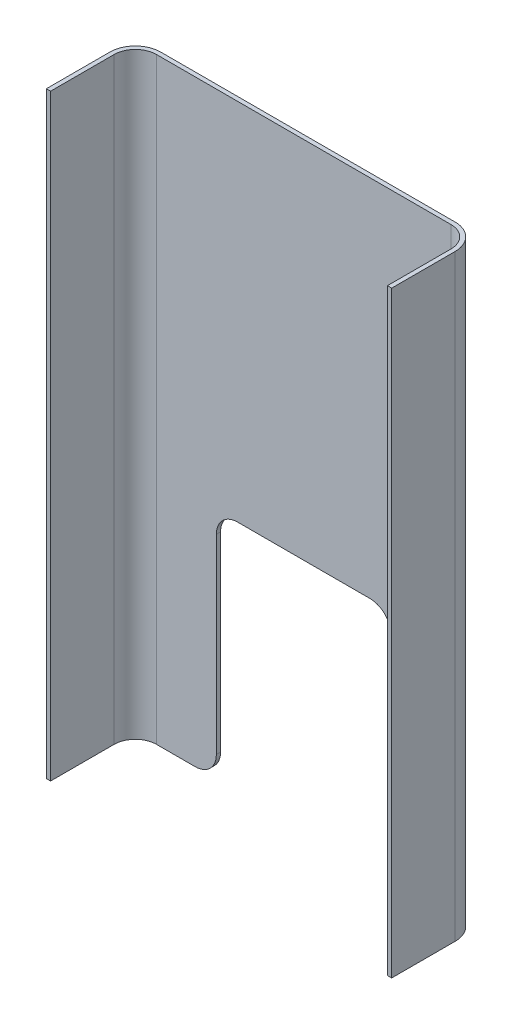
ISO-10303-21;
HEADER;
FILE_DESCRIPTION(('STEP AP214'),'2;1');
FILE_NAME('part.step','',(''),(''),'','','');
FILE_SCHEMA(('AUTOMOTIVE_DESIGN { 1 0 10303 214 1 1 1 1 }'));
ENDSEC;
DATA;
#1=APPLICATION_CONTEXT('core data for automotive mechanical design processes');
#2=APPLICATION_PROTOCOL_DEFINITION('international standard','automotive_design',2000,#1);
#3=PRODUCT_CONTEXT('',#1,'mechanical');
#4=PRODUCT('Part','Part','',(#3));
#5=PRODUCT_RELATED_PRODUCT_CATEGORY('part','',(#4));
#6=PRODUCT_DEFINITION_FORMATION('','',#4);
#7=PRODUCT_DEFINITION_CONTEXT('part definition',#1,'design');
#8=PRODUCT_DEFINITION('design','',#6,#7);
#9=PRODUCT_DEFINITION_SHAPE('','',#8);
#10=(LENGTH_UNIT() NAMED_UNIT(*) SI_UNIT(.MILLI.,.METRE.));
#11=(NAMED_UNIT(*) PLANE_ANGLE_UNIT() SI_UNIT($,.RADIAN.));
#12=(NAMED_UNIT(*) SI_UNIT($,.STERADIAN.) SOLID_ANGLE_UNIT());
#13=UNCERTAINTY_MEASURE_WITH_UNIT(LENGTH_MEASURE(1.E-05),#10,'distance_accuracy_value','');
#14=(GEOMETRIC_REPRESENTATION_CONTEXT(3) GLOBAL_UNCERTAINTY_ASSIGNED_CONTEXT((#13)) GLOBAL_UNIT_ASSIGNED_CONTEXT((#10,
#11,#12)) REPRESENTATION_CONTEXT('',''));
#15=CARTESIAN_POINT('',(0.,0.,0.));
#16=DIRECTION('',(0.,0.,1.));
#17=DIRECTION('',(1.,0.,0.));
#18=AXIS2_PLACEMENT_3D('',#15,#16,#17);
#19=CARTESIAN_POINT('',(139.,0.,20.));
#20=DIRECTION('',(0.,1.,0.));
#21=DIRECTION('',(1.,0.,0.));
#22=AXIS2_PLACEMENT_3D('',#19,#20,#21);
#23=PLANE('',#22);
#24=DIRECTION('',(1.,0.,0.));
#25=VECTOR('',#24,1.);
#26=CARTESIAN_POINT('',(-139.,0.,0.));
#27=LINE('',#26,#25);
#28=CARTESIAN_POINT('',(102.5,0.,0.));
#29=VERTEX_POINT('',#28);
#30=CARTESIAN_POINT('',(139.,0.,0.));
#31=VERTEX_POINT('',#30);
#32=EDGE_CURVE('E260',#29,#31,#27,.T.);
#33=ORIENTED_EDGE('',*,*,#32,.F.);
#34=DIRECTION('',(0.,0.,-1.));
#35=VECTOR('',#34,1.);
#36=CARTESIAN_POINT('',(102.5,0.,20.));
#37=LINE('',#36,#35);
#38=CARTESIAN_POINT('',(102.5,0.,-4.));
#39=VERTEX_POINT('',#38);
#40=EDGE_CURVE('E305',#29,#39,#37,.T.);
#41=ORIENTED_EDGE('',*,*,#40,.T.);
#42=DIRECTION('',(1.,0.,0.));
#43=VECTOR('',#42,1.);
#44=CARTESIAN_POINT('',(-139.,0.,-4.));
#45=LINE('',#44,#43);
#46=CARTESIAN_POINT('',(139.,0.,-3.99999999999999));
#47=VERTEX_POINT('',#46);
#48=EDGE_CURVE('E243',#39,#47,#45,.T.);
#49=ORIENTED_EDGE('',*,*,#48,.T.);
#50=CARTESIAN_POINT('',(139.,0.,20.));
#51=DIRECTION('',(0.,1.,0.));
#52=DIRECTION('',(1.,0.,0.));
#53=AXIS2_PLACEMENT_3D('',#50,#51,#52);
#54=CIRCLE('',#53,24.);
#55=CARTESIAN_POINT('',(163.,0.,20.));
#56=VERTEX_POINT('',#55);
#57=EDGE_CURVE('E240',#47,#56,#54,.F.);
#58=ORIENTED_EDGE('',*,*,#57,.T.);
#59=DIRECTION('',(0.,0.,-1.));
#60=VECTOR('',#59,1.);
#61=CARTESIAN_POINT('',(163.,0.,20.));
#62=LINE('',#61,#60);
#63=CARTESIAN_POINT('',(163.,0.,80.));
#64=VERTEX_POINT('',#63);
#65=EDGE_CURVE('E237',#56,#64,#62,.F.);
#66=ORIENTED_EDGE('',*,*,#65,.T.);
#67=DIRECTION('',(-1.,0.,0.));
#68=VECTOR('',#67,1.);
#69=CARTESIAN_POINT('',(163.,0.,80.));
#70=LINE('',#69,#68);
#71=CARTESIAN_POINT('',(159.,0.,80.));
#72=VERTEX_POINT('',#71);
#73=EDGE_CURVE('E234',#64,#72,#70,.T.);
#74=ORIENTED_EDGE('',*,*,#73,.T.);
#75=DIRECTION('',(0.,0.,1.));
#76=VECTOR('',#75,1.);
#77=CARTESIAN_POINT('',(159.,0.,20.));
#78=LINE('',#77,#76);
#79=CARTESIAN_POINT('',(159.,0.,20.));
#80=VERTEX_POINT('',#79);
#81=EDGE_CURVE('E197',#80,#72,#78,.T.);
#82=ORIENTED_EDGE('',*,*,#81,.F.);
#83=CARTESIAN_POINT('',(139.,0.,20.));
#84=DIRECTION('',(0.,-1.,0.));
#85=DIRECTION('',(0.,0.,-1.));
#86=AXIS2_PLACEMENT_3D('',#83,#84,#85);
#87=CIRCLE('',#86,20.);
#88=EDGE_CURVE('E191',#31,#80,#87,.T.);
#89=ORIENTED_EDGE('',*,*,#88,.F.);
#90=EDGE_LOOP('',(#33,#41,#49,#58,#66,#74,#82,#89));
#91=FACE_BOUND('',#90,.T.);
#92=ADVANCED_FACE('F41',(#91),#23,.F.);
#93=CARTESIAN_POINT('',(159.,564.,20.));
#94=DIRECTION('',(1.,0.,0.));
#95=DIRECTION('',(0.,0.,-1.));
#96=AXIS2_PLACEMENT_3D('',#93,#94,#95);
#97=PLANE('',#96);
#98=ORIENTED_EDGE('',*,*,#81,.T.);
#99=DIRECTION('',(0.,-1.,0.));
#100=VECTOR('',#99,1.);
#101=CARTESIAN_POINT('',(159.,564.,80.));
#102=LINE('',#101,#100);
#103=CARTESIAN_POINT('',(159.,564.,80.));
#104=VERTEX_POINT('',#103);
#105=EDGE_CURVE('E194',#104,#72,#102,.T.);
#106=ORIENTED_EDGE('',*,*,#105,.F.);
#107=DIRECTION('',(0.,0.,1.));
#108=VECTOR('',#107,1.);
#109=CARTESIAN_POINT('',(159.,564.,20.));
#110=LINE('',#109,#108);
#111=CARTESIAN_POINT('',(159.,564.,20.));
#112=VERTEX_POINT('',#111);
#113=EDGE_CURVE('E179',#112,#104,#110,.T.);
#114=ORIENTED_EDGE('',*,*,#113,.F.);
#115=DIRECTION('',(0.,-1.,0.));
#116=VECTOR('',#115,1.);
#117=CARTESIAN_POINT('',(159.,564.,20.));
#118=LINE('',#117,#116);
#119=EDGE_CURVE('E232',#112,#80,#118,.T.);
#120=ORIENTED_EDGE('',*,*,#119,.T.);
#121=EDGE_LOOP('',(#98,#106,#114,#120));
#122=FACE_BOUND('',#121,.T.);
#123=ADVANCED_FACE('F195',(#122),#97,.F.);
#124=CARTESIAN_POINT('',(163.,564.,80.));
#125=DIRECTION('',(0.,0.,1.));
#126=DIRECTION('',(1.,0.,0.));
#127=AXIS2_PLACEMENT_3D('',#124,#125,#126);
#128=PLANE('',#127);
#129=ORIENTED_EDGE('',*,*,#73,.F.);
#130=DIRECTION('',(0.,-1.,0.));
#131=VECTOR('',#130,1.);
#132=CARTESIAN_POINT('',(163.,564.,80.));
#133=LINE('',#132,#131);
#134=CARTESIAN_POINT('',(163.,564.,80.));
#135=VERTEX_POINT('',#134);
#136=EDGE_CURVE('E202',#135,#64,#133,.T.);
#137=ORIENTED_EDGE('',*,*,#136,.F.);
#138=DIRECTION('',(-1.,0.,0.));
#139=VECTOR('',#138,1.);
#140=CARTESIAN_POINT('',(163.,564.,80.));
#141=LINE('',#140,#139);
#142=EDGE_CURVE('E184',#135,#104,#141,.T.);
#143=ORIENTED_EDGE('',*,*,#142,.T.);
#144=ORIENTED_EDGE('',*,*,#105,.T.);
#145=EDGE_LOOP('',(#129,#137,#143,#144));
#146=FACE_BOUND('',#145,.T.);
#147=ADVANCED_FACE('F204',(#146),#128,.T.);
#148=CARTESIAN_POINT('',(163.,564.,20.));
#149=DIRECTION('',(1.,0.,0.));
#150=DIRECTION('',(0.,0.,-1.));
#151=AXIS2_PLACEMENT_3D('',#148,#149,#150);
#152=PLANE('',#151);
#153=ORIENTED_EDGE('',*,*,#65,.F.);
#154=DIRECTION('',(0.,-1.,0.));
#155=VECTOR('',#154,1.);
#156=CARTESIAN_POINT('',(163.,564.,20.));
#157=LINE('',#156,#155);
#158=CARTESIAN_POINT('',(163.,564.,20.));
#159=VERTEX_POINT('',#158);
#160=EDGE_CURVE('E286',#159,#56,#157,.T.);
#161=ORIENTED_EDGE('',*,*,#160,.F.);
#162=DIRECTION('',(0.,0.,-1.));
#163=VECTOR('',#162,1.);
#164=CARTESIAN_POINT('',(163.,564.,20.));
#165=LINE('',#164,#163);
#166=EDGE_CURVE('E205',#159,#135,#165,.F.);
#167=ORIENTED_EDGE('',*,*,#166,.T.);
#168=ORIENTED_EDGE('',*,*,#136,.T.);
#169=EDGE_LOOP('',(#153,#161,#167,#168));
#170=FACE_BOUND('',#169,.T.);
#171=ADVANCED_FACE('F395',(#170),#152,.T.);
#172=CARTESIAN_POINT('',(139.,564.,20.));
#173=DIRECTION('',(0.,-1.,0.));
#174=DIRECTION('',(0.,0.,-1.));
#175=AXIS2_PLACEMENT_3D('',#172,#173,#174);
#176=CYLINDRICAL_SURFACE('',#175,24.);
#177=ORIENTED_EDGE('',*,*,#57,.F.);
#178=DIRECTION('',(0.,-1.,0.));
#179=VECTOR('',#178,1.);
#180=CARTESIAN_POINT('',(139.,564.,-3.99999999999999));
#181=LINE('',#180,#179);
#182=CARTESIAN_POINT('',(139.,564.,-3.99999999999999));
#183=VERTEX_POINT('',#182);
#184=EDGE_CURVE('E283',#183,#47,#181,.T.);
#185=ORIENTED_EDGE('',*,*,#184,.F.);
#186=CARTESIAN_POINT('',(139.,564.,20.));
#187=DIRECTION('',(0.,1.,0.));
#188=DIRECTION('',(1.,0.,0.));
#189=AXIS2_PLACEMENT_3D('',#186,#187,#188);
#190=CIRCLE('',#189,24.);
#191=EDGE_CURVE('E207',#183,#159,#190,.F.);
#192=ORIENTED_EDGE('',*,*,#191,.T.);
#193=ORIENTED_EDGE('',*,*,#160,.T.);
#194=EDGE_LOOP('',(#177,#185,#192,#193));
#195=FACE_BOUND('',#194,.T.);
#196=ADVANCED_FACE('F392',(#195),#176,.T.);
#197=CARTESIAN_POINT('',(-139.,564.,-4.));
#198=DIRECTION('',(0.,0.,-1.));
#199=DIRECTION('',(-1.,0.,0.));
#200=AXIS2_PLACEMENT_3D('',#197,#198,#199);
#201=PLANE('',#200);
#202=DIRECTION('',(0.,1.,0.));
#203=VECTOR('',#202,1.);
#204=CARTESIAN_POINT('',(-82.5,564.,-4.));
#205=LINE('',#204,#203);
#206=CARTESIAN_POINT('',(-82.5,20.,-4.));
#207=VERTEX_POINT('',#206);
#208=CARTESIAN_POINT('',(-82.5,200.,-4.));
#209=VERTEX_POINT('',#208);
#210=EDGE_CURVE('E322',#207,#209,#205,.T.);
#211=ORIENTED_EDGE('',*,*,#210,.F.);
#212=CARTESIAN_POINT('',(-102.5,20.,-4.));
#213=DIRECTION('',(0.,0.,-1.));
#214=DIRECTION('',(-1.,0.,0.));
#215=AXIS2_PLACEMENT_3D('',#212,#213,#214);
#216=CIRCLE('',#215,20.);
#217=CARTESIAN_POINT('',(-102.5,0.,-4.));
#218=VERTEX_POINT('',#217);
#219=EDGE_CURVE('E303',#207,#218,#216,.T.);
#220=ORIENTED_EDGE('',*,*,#219,.T.);
#221=CARTESIAN_POINT('',(-139.,0.,-4.));
#222=VERTEX_POINT('',#221);
#223=EDGE_CURVE('E244',#222,#218,#45,.T.);
#224=ORIENTED_EDGE('',*,*,#223,.F.);
#225=DIRECTION('',(0.,-1.,0.));
#226=VECTOR('',#225,1.);
#227=CARTESIAN_POINT('',(-139.,564.,-4.));
#228=LINE('',#227,#226);
#229=CARTESIAN_POINT('',(-139.,564.,-4.));
#230=VERTEX_POINT('',#229);
#231=EDGE_CURVE('E281',#230,#222,#228,.T.);
#232=ORIENTED_EDGE('',*,*,#231,.F.);
#233=DIRECTION('',(1.,0.,0.));
#234=VECTOR('',#233,1.);
#235=CARTESIAN_POINT('',(-139.,564.,-4.));
#236=LINE('',#235,#234);
#237=EDGE_CURVE('E213',#230,#183,#236,.T.);
#238=ORIENTED_EDGE('',*,*,#237,.T.);
#239=ORIENTED_EDGE('',*,*,#184,.T.);
#240=ORIENTED_EDGE('',*,*,#48,.F.);
#241=CARTESIAN_POINT('',(102.5,20.,-4.));
#242=DIRECTION('',(0.,0.,-1.));
#243=DIRECTION('',(-1.,0.,0.));
#244=AXIS2_PLACEMENT_3D('',#241,#242,#243);
#245=CIRCLE('',#244,20.);
#246=CARTESIAN_POINT('',(82.5,20.,-4.));
#247=VERTEX_POINT('',#246);
#248=EDGE_CURVE('E56',#39,#247,#245,.T.);
#249=ORIENTED_EDGE('',*,*,#248,.T.);
#250=DIRECTION('',(0.,-1.,0.));
#251=VECTOR('',#250,1.);
#252=CARTESIAN_POINT('',(82.5,564.,-4.));
#253=LINE('',#252,#251);
#254=CARTESIAN_POINT('',(82.5,200.,-4.));
#255=VERTEX_POINT('',#254);
#256=EDGE_CURVE('E352',#255,#247,#253,.T.);
#257=ORIENTED_EDGE('',*,*,#256,.F.);
#258=CARTESIAN_POINT('',(62.5,200.,-4.));
#259=DIRECTION('',(0.,0.,-1.));
#260=DIRECTION('',(-1.,0.,0.));
#261=AXIS2_PLACEMENT_3D('',#258,#259,#260);
#262=CIRCLE('',#261,20.);
#263=CARTESIAN_POINT('',(62.5,220.,-4.));
#264=VERTEX_POINT('',#263);
#265=EDGE_CURVE('E64',#255,#264,#262,.F.);
#266=ORIENTED_EDGE('',*,*,#265,.T.);
#267=DIRECTION('',(1.,0.,0.));
#268=VECTOR('',#267,1.);
#269=CARTESIAN_POINT('',(-139.,220.,-4.));
#270=LINE('',#269,#268);
#271=CARTESIAN_POINT('',(-62.5,220.,-4.));
#272=VERTEX_POINT('',#271);
#273=EDGE_CURVE('E235',#272,#264,#270,.T.);
#274=ORIENTED_EDGE('',*,*,#273,.F.);
#275=CARTESIAN_POINT('',(-62.5,200.,-4.));
#276=DIRECTION('',(0.,0.,-1.));
#277=DIRECTION('',(-1.,0.,0.));
#278=AXIS2_PLACEMENT_3D('',#275,#276,#277);
#279=CIRCLE('',#278,20.);
#280=EDGE_CURVE('E49',#272,#209,#279,.F.);
#281=ORIENTED_EDGE('',*,*,#280,.T.);
#282=EDGE_LOOP('',(#211,#220,#224,#232,#238,#239,#240,#249,#257,#266,#274,#281));
#283=FACE_BOUND('',#282,.T.);
#284=ADVANCED_FACE('F321',(#283),#201,.T.);
#285=CARTESIAN_POINT('',(-139.,564.,20.));
#286=DIRECTION('',(0.,-1.,0.));
#287=DIRECTION('',(0.,0.,-1.));
#288=AXIS2_PLACEMENT_3D('',#285,#286,#287);
#289=CYLINDRICAL_SURFACE('',#288,24.);
#290=CARTESIAN_POINT('',(-139.,0.,20.));
#291=DIRECTION('',(0.,1.,0.));
#292=DIRECTION('',(1.,0.,0.));
#293=AXIS2_PLACEMENT_3D('',#290,#291,#292);
#294=CIRCLE('',#293,24.);
#295=CARTESIAN_POINT('',(-163.,0.,20.));
#296=VERTEX_POINT('',#295);
#297=EDGE_CURVE('E247',#296,#222,#294,.F.);
#298=ORIENTED_EDGE('',*,*,#297,.F.);
#299=DIRECTION('',(0.,-1.,0.));
#300=VECTOR('',#299,1.);
#301=CARTESIAN_POINT('',(-163.,564.,20.));
#302=LINE('',#301,#300);
#303=CARTESIAN_POINT('',(-163.,564.,20.));
#304=VERTEX_POINT('',#303);
#305=EDGE_CURVE('E279',#304,#296,#302,.T.);
#306=ORIENTED_EDGE('',*,*,#305,.F.);
#307=CARTESIAN_POINT('',(-139.,564.,20.));
#308=DIRECTION('',(0.,1.,0.));
#309=DIRECTION('',(1.,0.,0.));
#310=AXIS2_PLACEMENT_3D('',#307,#308,#309);
#311=CIRCLE('',#310,24.);
#312=EDGE_CURVE('E216',#304,#230,#311,.F.);
#313=ORIENTED_EDGE('',*,*,#312,.T.);
#314=ORIENTED_EDGE('',*,*,#231,.T.);
#315=EDGE_LOOP('',(#298,#306,#313,#314));
#316=FACE_BOUND('',#315,.T.);
#317=ADVANCED_FACE('F385',(#316),#289,.T.);
#318=CARTESIAN_POINT('',(-163.,564.,80.));
#319=DIRECTION('',(-1.,0.,0.));
#320=DIRECTION('',(0.,0.,1.));
#321=AXIS2_PLACEMENT_3D('',#318,#319,#320);
#322=PLANE('',#321);
#323=DIRECTION('',(0.,0.,-1.));
#324=VECTOR('',#323,1.);
#325=CARTESIAN_POINT('',(-163.,0.,80.));
#326=LINE('',#325,#324);
#327=CARTESIAN_POINT('',(-163.,0.,80.));
#328=VERTEX_POINT('',#327);
#329=EDGE_CURVE('E250',#328,#296,#326,.T.);
#330=ORIENTED_EDGE('',*,*,#329,.F.);
#331=DIRECTION('',(0.,-1.,0.));
#332=VECTOR('',#331,1.);
#333=CARTESIAN_POINT('',(-163.,564.,80.));
#334=LINE('',#333,#332);
#335=CARTESIAN_POINT('',(-163.,564.,80.));
#336=VERTEX_POINT('',#335);
#337=EDGE_CURVE('E277',#336,#328,#334,.T.);
#338=ORIENTED_EDGE('',*,*,#337,.F.);
#339=DIRECTION('',(0.,0.,-1.));
#340=VECTOR('',#339,1.);
#341=CARTESIAN_POINT('',(-163.,564.,80.));
#342=LINE('',#341,#340);
#343=EDGE_CURVE('E219',#336,#304,#342,.T.);
#344=ORIENTED_EDGE('',*,*,#343,.T.);
#345=ORIENTED_EDGE('',*,*,#305,.T.);
#346=EDGE_LOOP('',(#330,#338,#344,#345));
#347=FACE_BOUND('',#346,.T.);
#348=ADVANCED_FACE('F525',(#347),#322,.T.);
#349=CARTESIAN_POINT('',(-159.,564.,80.));
#350=DIRECTION('',(0.,0.,1.));
#351=DIRECTION('',(1.,0.,0.));
#352=AXIS2_PLACEMENT_3D('',#349,#350,#351);
#353=PLANE('',#352);
#354=DIRECTION('',(-1.,0.,0.));
#355=VECTOR('',#354,1.);
#356=CARTESIAN_POINT('',(-159.,0.,80.));
#357=LINE('',#356,#355);
#358=CARTESIAN_POINT('',(-159.,0.,80.));
#359=VERTEX_POINT('',#358);
#360=EDGE_CURVE('E253',#359,#328,#357,.T.);
#361=ORIENTED_EDGE('',*,*,#360,.F.);
#362=DIRECTION('',(0.,-1.,0.));
#363=VECTOR('',#362,1.);
#364=CARTESIAN_POINT('',(-159.,564.,80.));
#365=LINE('',#364,#363);
#366=CARTESIAN_POINT('',(-159.,564.,80.));
#367=VERTEX_POINT('',#366);
#368=EDGE_CURVE('E275',#367,#359,#365,.T.);
#369=ORIENTED_EDGE('',*,*,#368,.F.);
#370=DIRECTION('',(-1.,0.,0.));
#371=VECTOR('',#370,1.);
#372=CARTESIAN_POINT('',(-159.,564.,80.));
#373=LINE('',#372,#371);
#374=EDGE_CURVE('E222',#367,#336,#373,.T.);
#375=ORIENTED_EDGE('',*,*,#374,.T.);
#376=ORIENTED_EDGE('',*,*,#337,.T.);
#377=EDGE_LOOP('',(#361,#369,#375,#376));
#378=FACE_BOUND('',#377,.T.);
#379=ADVANCED_FACE('F515',(#378),#353,.T.);
#380=CARTESIAN_POINT('',(-159.,564.,80.));
#381=DIRECTION('',(-1.,0.,0.));
#382=DIRECTION('',(0.,0.,1.));
#383=AXIS2_PLACEMENT_3D('',#380,#381,#382);
#384=PLANE('',#383);
#385=DIRECTION('',(0.,0.,-1.));
#386=VECTOR('',#385,1.);
#387=CARTESIAN_POINT('',(-159.,0.,80.));
#388=LINE('',#387,#386);
#389=CARTESIAN_POINT('',(-159.,0.,20.));
#390=VERTEX_POINT('',#389);
#391=EDGE_CURVE('E256',#359,#390,#388,.T.);
#392=ORIENTED_EDGE('',*,*,#391,.T.);
#393=DIRECTION('',(0.,-1.,0.));
#394=VECTOR('',#393,1.);
#395=CARTESIAN_POINT('',(-159.,564.,20.));
#396=LINE('',#395,#394);
#397=CARTESIAN_POINT('',(-159.,564.,20.));
#398=VERTEX_POINT('',#397);
#399=EDGE_CURVE('E272',#398,#390,#396,.T.);
#400=ORIENTED_EDGE('',*,*,#399,.F.);
#401=DIRECTION('',(0.,0.,-1.));
#402=VECTOR('',#401,1.);
#403=CARTESIAN_POINT('',(-159.,564.,80.));
#404=LINE('',#403,#402);
#405=EDGE_CURVE('E225',#367,#398,#404,.T.);
#406=ORIENTED_EDGE('',*,*,#405,.F.);
#407=ORIENTED_EDGE('',*,*,#368,.T.);
#408=EDGE_LOOP('',(#392,#400,#406,#407));
#409=FACE_BOUND('',#408,.T.);
#410=ADVANCED_FACE('F506',(#409),#384,.F.);
#411=CARTESIAN_POINT('',(-139.,564.,20.));
#412=DIRECTION('',(0.,-1.,0.));
#413=DIRECTION('',(0.,0.,-1.));
#414=AXIS2_PLACEMENT_3D('',#411,#412,#413);
#415=CYLINDRICAL_SURFACE('',#414,20.);
#416=CARTESIAN_POINT('',(-139.,0.,20.));
#417=DIRECTION('',(0.,-1.,0.));
#418=DIRECTION('',(0.,0.,-1.));
#419=AXIS2_PLACEMENT_3D('',#416,#417,#418);
#420=CIRCLE('',#419,20.);
#421=CARTESIAN_POINT('',(-139.,0.,0.));
#422=VERTEX_POINT('',#421);
#423=EDGE_CURVE('E258',#390,#422,#420,.T.);
#424=ORIENTED_EDGE('',*,*,#423,.T.);
#425=DIRECTION('',(0.,-1.,0.));
#426=VECTOR('',#425,1.);
#427=CARTESIAN_POINT('',(-139.,564.,0.));
#428=LINE('',#427,#426);
#429=CARTESIAN_POINT('',(-139.,564.,0.));
#430=VERTEX_POINT('',#429);
#431=EDGE_CURVE('E269',#430,#422,#428,.T.);
#432=ORIENTED_EDGE('',*,*,#431,.F.);
#433=CARTESIAN_POINT('',(-139.,564.,20.));
#434=DIRECTION('',(0.,-1.,0.));
#435=DIRECTION('',(0.,0.,-1.));
#436=AXIS2_PLACEMENT_3D('',#433,#434,#435);
#437=CIRCLE('',#436,20.);
#438=EDGE_CURVE('E227',#398,#430,#437,.T.);
#439=ORIENTED_EDGE('',*,*,#438,.F.);
#440=ORIENTED_EDGE('',*,*,#399,.T.);
#441=EDGE_LOOP('',(#424,#432,#439,#440));
#442=FACE_BOUND('',#441,.T.);
#443=ADVANCED_FACE('F372',(#442),#415,.F.);
#444=CARTESIAN_POINT('',(-139.,564.,0.));
#445=DIRECTION('',(0.,0.,-1.));
#446=DIRECTION('',(-1.,0.,0.));
#447=AXIS2_PLACEMENT_3D('',#444,#445,#446);
#448=PLANE('',#447);
#449=CARTESIAN_POINT('',(-102.5,0.,0.));
#450=VERTEX_POINT('',#449);
#451=EDGE_CURVE('E261',#422,#450,#27,.T.);
#452=ORIENTED_EDGE('',*,*,#451,.T.);
#453=CARTESIAN_POINT('',(-102.5,20.,0.));
#454=DIRECTION('',(0.,0.,-1.));
#455=DIRECTION('',(-1.,0.,0.));
#456=AXIS2_PLACEMENT_3D('',#453,#454,#455);
#457=CIRCLE('',#456,20.);
#458=CARTESIAN_POINT('',(-82.5,20.,0.));
#459=VERTEX_POINT('',#458);
#460=EDGE_CURVE('E296',#450,#459,#457,.F.);
#461=ORIENTED_EDGE('',*,*,#460,.T.);
#462=DIRECTION('',(0.,1.,0.));
#463=VECTOR('',#462,1.);
#464=CARTESIAN_POINT('',(-82.5,564.,0.));
#465=LINE('',#464,#463);
#466=CARTESIAN_POINT('',(-82.5,200.,0.));
#467=VERTEX_POINT('',#466);
#468=EDGE_CURVE('E333',#459,#467,#465,.T.);
#469=ORIENTED_EDGE('',*,*,#468,.T.);
#470=CARTESIAN_POINT('',(-62.5,200.,0.));
#471=DIRECTION('',(0.,0.,-1.));
#472=DIRECTION('',(-1.,0.,0.));
#473=AXIS2_PLACEMENT_3D('',#470,#471,#472);
#474=CIRCLE('',#473,20.);
#475=CARTESIAN_POINT('',(-62.5,220.,0.));
#476=VERTEX_POINT('',#475);
#477=EDGE_CURVE('E11',#467,#476,#474,.T.);
#478=ORIENTED_EDGE('',*,*,#477,.T.);
#479=DIRECTION('',(1.,0.,0.));
#480=VECTOR('',#479,1.);
#481=CARTESIAN_POINT('',(-139.,220.,0.));
#482=LINE('',#481,#480);
#483=CARTESIAN_POINT('',(62.5,220.,0.));
#484=VERTEX_POINT('',#483);
#485=EDGE_CURVE('E201',#476,#484,#482,.T.);
#486=ORIENTED_EDGE('',*,*,#485,.T.);
#487=CARTESIAN_POINT('',(62.5,200.,0.));
#488=DIRECTION('',(0.,0.,-1.));
#489=DIRECTION('',(-1.,0.,0.));
#490=AXIS2_PLACEMENT_3D('',#487,#488,#489);
#491=CIRCLE('',#490,20.);
#492=CARTESIAN_POINT('',(82.5,200.,0.));
#493=VERTEX_POINT('',#492);
#494=EDGE_CURVE('E318',#484,#493,#491,.T.);
#495=ORIENTED_EDGE('',*,*,#494,.T.);
#496=DIRECTION('',(0.,-1.,0.));
#497=VECTOR('',#496,1.);
#498=CARTESIAN_POINT('',(82.5,564.,0.));
#499=LINE('',#498,#497);
#500=CARTESIAN_POINT('',(82.5,20.,0.));
#501=VERTEX_POINT('',#500);
#502=EDGE_CURVE('E332',#493,#501,#499,.T.);
#503=ORIENTED_EDGE('',*,*,#502,.T.);
#504=CARTESIAN_POINT('',(102.5,20.,0.));
#505=DIRECTION('',(0.,0.,-1.));
#506=DIRECTION('',(-1.,0.,0.));
#507=AXIS2_PLACEMENT_3D('',#504,#505,#506);
#508=CIRCLE('',#507,20.);
#509=EDGE_CURVE('E294',#501,#29,#508,.F.);
#510=ORIENTED_EDGE('',*,*,#509,.T.);
#511=ORIENTED_EDGE('',*,*,#32,.T.);
#512=DIRECTION('',(0.,-1.,0.));
#513=VECTOR('',#512,1.);
#514=CARTESIAN_POINT('',(139.,564.,0.));
#515=LINE('',#514,#513);
#516=CARTESIAN_POINT('',(139.,564.,0.));
#517=VERTEX_POINT('',#516);
#518=EDGE_CURVE('E266',#517,#31,#515,.T.);
#519=ORIENTED_EDGE('',*,*,#518,.F.);
#520=DIRECTION('',(1.,0.,0.));
#521=VECTOR('',#520,1.);
#522=CARTESIAN_POINT('',(-139.,564.,0.));
#523=LINE('',#522,#521);
#524=EDGE_CURVE('E229',#430,#517,#523,.T.);
#525=ORIENTED_EDGE('',*,*,#524,.F.);
#526=ORIENTED_EDGE('',*,*,#431,.T.);
#527=EDGE_LOOP('',(#452,#461,#469,#478,#486,#495,#503,#510,#511,#519,#525,#526));
#528=FACE_BOUND('',#527,.T.);
#529=ADVANCED_FACE('F338',(#528),#448,.F.);
#530=CARTESIAN_POINT('',(139.,564.,20.));
#531=DIRECTION('',(0.,-1.,0.));
#532=DIRECTION('',(0.,0.,-1.));
#533=AXIS2_PLACEMENT_3D('',#530,#531,#532);
#534=CYLINDRICAL_SURFACE('',#533,20.);
#535=ORIENTED_EDGE('',*,*,#88,.T.);
#536=ORIENTED_EDGE('',*,*,#119,.F.);
#537=CARTESIAN_POINT('',(139.,564.,20.));
#538=DIRECTION('',(0.,-1.,0.));
#539=DIRECTION('',(0.,0.,-1.));
#540=AXIS2_PLACEMENT_3D('',#537,#538,#539);
#541=CIRCLE('',#540,20.);
#542=EDGE_CURVE('E187',#517,#112,#541,.T.);
#543=ORIENTED_EDGE('',*,*,#542,.F.);
#544=ORIENTED_EDGE('',*,*,#518,.T.);
#545=EDGE_LOOP('',(#535,#536,#543,#544));
#546=FACE_BOUND('',#545,.T.);
#547=ADVANCED_FACE('F363',(#546),#534,.F.);
#548=CARTESIAN_POINT('',(139.,564.,20.));
#549=DIRECTION('',(0.,1.,0.));
#550=DIRECTION('',(1.,0.,0.));
#551=AXIS2_PLACEMENT_3D('',#548,#549,#550);
#552=PLANE('',#551);
#553=ORIENTED_EDGE('',*,*,#113,.T.);
#554=ORIENTED_EDGE('',*,*,#142,.F.);
#555=ORIENTED_EDGE('',*,*,#166,.F.);
#556=ORIENTED_EDGE('',*,*,#191,.F.);
#557=ORIENTED_EDGE('',*,*,#237,.F.);
#558=ORIENTED_EDGE('',*,*,#312,.F.);
#559=ORIENTED_EDGE('',*,*,#343,.F.);
#560=ORIENTED_EDGE('',*,*,#374,.F.);
#561=ORIENTED_EDGE('',*,*,#405,.T.);
#562=ORIENTED_EDGE('',*,*,#438,.T.);
#563=ORIENTED_EDGE('',*,*,#524,.T.);
#564=ORIENTED_EDGE('',*,*,#542,.T.);
#565=EDGE_LOOP('',(#553,#554,#555,#556,#557,#558,#559,#560,#561,#562,#563,#564));
#566=FACE_BOUND('',#565,.T.);
#567=ADVANCED_FACE('F181',(#566),#552,.T.);
#568=ORIENTED_EDGE('',*,*,#223,.T.);
#569=DIRECTION('',(0.,0.,1.));
#570=VECTOR('',#569,1.);
#571=CARTESIAN_POINT('',(-102.5,0.,20.));
#572=LINE('',#571,#570);
#573=EDGE_CURVE('E291',#218,#450,#572,.T.);
#574=ORIENTED_EDGE('',*,*,#573,.T.);
#575=ORIENTED_EDGE('',*,*,#451,.F.);
#576=ORIENTED_EDGE('',*,*,#423,.F.);
#577=ORIENTED_EDGE('',*,*,#391,.F.);
#578=ORIENTED_EDGE('',*,*,#360,.T.);
#579=ORIENTED_EDGE('',*,*,#329,.T.);
#580=ORIENTED_EDGE('',*,*,#297,.T.);
#581=EDGE_LOOP('',(#568,#574,#575,#576,#577,#578,#579,#580));
#582=FACE_BOUND('',#581,.T.);
#583=ADVANCED_FACE('F376',(#582),#23,.F.);
#584=CARTESIAN_POINT('',(82.5,220.,80.));
#585=DIRECTION('',(0.,1.,0.));
#586=DIRECTION('',(0.,0.,1.));
#587=AXIS2_PLACEMENT_3D('',#584,#585,#586);
#588=PLANE('',#587);
#589=ORIENTED_EDGE('',*,*,#273,.T.);
#590=DIRECTION('',(0.,0.,-1.));
#591=VECTOR('',#590,1.);
#592=CARTESIAN_POINT('',(62.5,220.,0.));
#593=LINE('',#592,#591);
#594=EDGE_CURVE('E315',#264,#484,#593,.F.);
#595=ORIENTED_EDGE('',*,*,#594,.T.);
#596=ORIENTED_EDGE('',*,*,#485,.F.);
#597=DIRECTION('',(0.,0.,-1.));
#598=VECTOR('',#597,1.);
#599=CARTESIAN_POINT('',(-62.5,220.,-3.99999999999998));
#600=LINE('',#599,#598);
#601=EDGE_CURVE('E312',#476,#272,#600,.T.);
#602=ORIENTED_EDGE('',*,*,#601,.T.);
#603=EDGE_LOOP('',(#589,#595,#596,#602));
#604=FACE_BOUND('',#603,.T.);
#605=ADVANCED_FACE('F341',(#604),#588,.F.);
#606=CARTESIAN_POINT('',(82.5,0.,80.));
#607=DIRECTION('',(1.,0.,0.));
#608=DIRECTION('',(0.,0.,-1.));
#609=AXIS2_PLACEMENT_3D('',#606,#607,#608);
#610=PLANE('',#609);
#611=ORIENTED_EDGE('',*,*,#256,.T.);
#612=DIRECTION('',(0.,0.,-1.));
#613=VECTOR('',#612,1.);
#614=CARTESIAN_POINT('',(82.5,20.,80.));
#615=LINE('',#614,#613);
#616=EDGE_CURVE('E310',#247,#501,#615,.F.);
#617=ORIENTED_EDGE('',*,*,#616,.T.);
#618=ORIENTED_EDGE('',*,*,#502,.F.);
#619=DIRECTION('',(0.,0.,-1.));
#620=VECTOR('',#619,1.);
#621=CARTESIAN_POINT('',(82.5,200.,-3.99999999999998));
#622=LINE('',#621,#620);
#623=EDGE_CURVE('E307',#493,#255,#622,.T.);
#624=ORIENTED_EDGE('',*,*,#623,.T.);
#625=EDGE_LOOP('',(#611,#617,#618,#624));
#626=FACE_BOUND('',#625,.T.);
#627=ADVANCED_FACE('F351',(#626),#610,.F.);
#628=CARTESIAN_POINT('',(-82.5,0.,80.));
#629=DIRECTION('',(-1.,0.,0.));
#630=DIRECTION('',(0.,0.,1.));
#631=AXIS2_PLACEMENT_3D('',#628,#629,#630);
#632=PLANE('',#631);
#633=ORIENTED_EDGE('',*,*,#468,.F.);
#634=DIRECTION('',(0.,0.,1.));
#635=VECTOR('',#634,1.);
#636=CARTESIAN_POINT('',(-82.5,20.,80.));
#637=LINE('',#636,#635);
#638=EDGE_CURVE('E300',#459,#207,#637,.F.);
#639=ORIENTED_EDGE('',*,*,#638,.T.);
#640=ORIENTED_EDGE('',*,*,#210,.T.);
#641=DIRECTION('',(0.,0.,-1.));
#642=VECTOR('',#641,1.);
#643=CARTESIAN_POINT('',(-82.5,200.,0.));
#644=LINE('',#643,#642);
#645=EDGE_CURVE('E298',#209,#467,#644,.F.);
#646=ORIENTED_EDGE('',*,*,#645,.T.);
#647=EDGE_LOOP('',(#633,#639,#640,#646));
#648=FACE_BOUND('',#647,.T.);
#649=ADVANCED_FACE('F329',(#648),#632,.F.);
#650=CARTESIAN_POINT('',(-102.5,20.,20.));
#651=DIRECTION('',(0.,0.,1.));
#652=DIRECTION('',(1.,0.,0.));
#653=AXIS2_PLACEMENT_3D('',#650,#651,#652);
#654=CYLINDRICAL_SURFACE('',#653,20.);
#655=ORIENTED_EDGE('',*,*,#219,.F.);
#656=ORIENTED_EDGE('',*,*,#638,.F.);
#657=ORIENTED_EDGE('',*,*,#460,.F.);
#658=ORIENTED_EDGE('',*,*,#573,.F.);
#659=EDGE_LOOP('',(#655,#656,#657,#658));
#660=FACE_BOUND('',#659,.T.);
#661=ADVANCED_FACE('F380',(#660),#654,.T.);
#662=CARTESIAN_POINT('',(102.5,20.,20.));
#663=DIRECTION('',(0.,0.,-1.));
#664=DIRECTION('',(-1.,0.,0.));
#665=AXIS2_PLACEMENT_3D('',#662,#663,#664);
#666=CYLINDRICAL_SURFACE('',#665,20.);
#667=ORIENTED_EDGE('',*,*,#509,.F.);
#668=ORIENTED_EDGE('',*,*,#616,.F.);
#669=ORIENTED_EDGE('',*,*,#248,.F.);
#670=ORIENTED_EDGE('',*,*,#40,.F.);
#671=EDGE_LOOP('',(#667,#668,#669,#670));
#672=FACE_BOUND('',#671,.T.);
#673=ADVANCED_FACE('F356',(#672),#666,.T.);
#674=CARTESIAN_POINT('',(62.5,200.,80.));
#675=DIRECTION('',(0.,0.,1.));
#676=DIRECTION('',(1.,0.,0.));
#677=AXIS2_PLACEMENT_3D('',#674,#675,#676);
#678=CYLINDRICAL_SURFACE('',#677,20.);
#679=ORIENTED_EDGE('',*,*,#494,.F.);
#680=ORIENTED_EDGE('',*,*,#594,.F.);
#681=ORIENTED_EDGE('',*,*,#265,.F.);
#682=ORIENTED_EDGE('',*,*,#623,.F.);
#683=EDGE_LOOP('',(#679,#680,#681,#682));
#684=FACE_BOUND('',#683,.T.);
#685=ADVANCED_FACE('F344',(#684),#678,.F.);
#686=CARTESIAN_POINT('',(-62.5,200.,80.));
#687=DIRECTION('',(0.,0.,1.));
#688=DIRECTION('',(1.,0.,0.));
#689=AXIS2_PLACEMENT_3D('',#686,#687,#688);
#690=CYLINDRICAL_SURFACE('',#689,20.);
#691=ORIENTED_EDGE('',*,*,#477,.F.);
#692=ORIENTED_EDGE('',*,*,#645,.F.);
#693=ORIENTED_EDGE('',*,*,#280,.F.);
#694=ORIENTED_EDGE('',*,*,#601,.F.);
#695=EDGE_LOOP('',(#691,#692,#693,#694));
#696=FACE_BOUND('',#695,.T.);
#697=ADVANCED_FACE('F43',(#696),#690,.F.);
#698=CLOSED_SHELL('',(#92,#123,#147,#171,#196,#284,#317,#348,#379,#410,#443,#529,#547,#567,#583,
#605,#627,#649,#661,#673,#685,#697));
#699=MANIFOLD_SOLID_BREP('B2',#698);
#700=ADVANCED_BREP_SHAPE_REPRESENTATION('',(#18,#699),#14);
#701=SHAPE_DEFINITION_REPRESENTATION(#9,#700);
ENDSEC;
END-ISO-10303-21;
